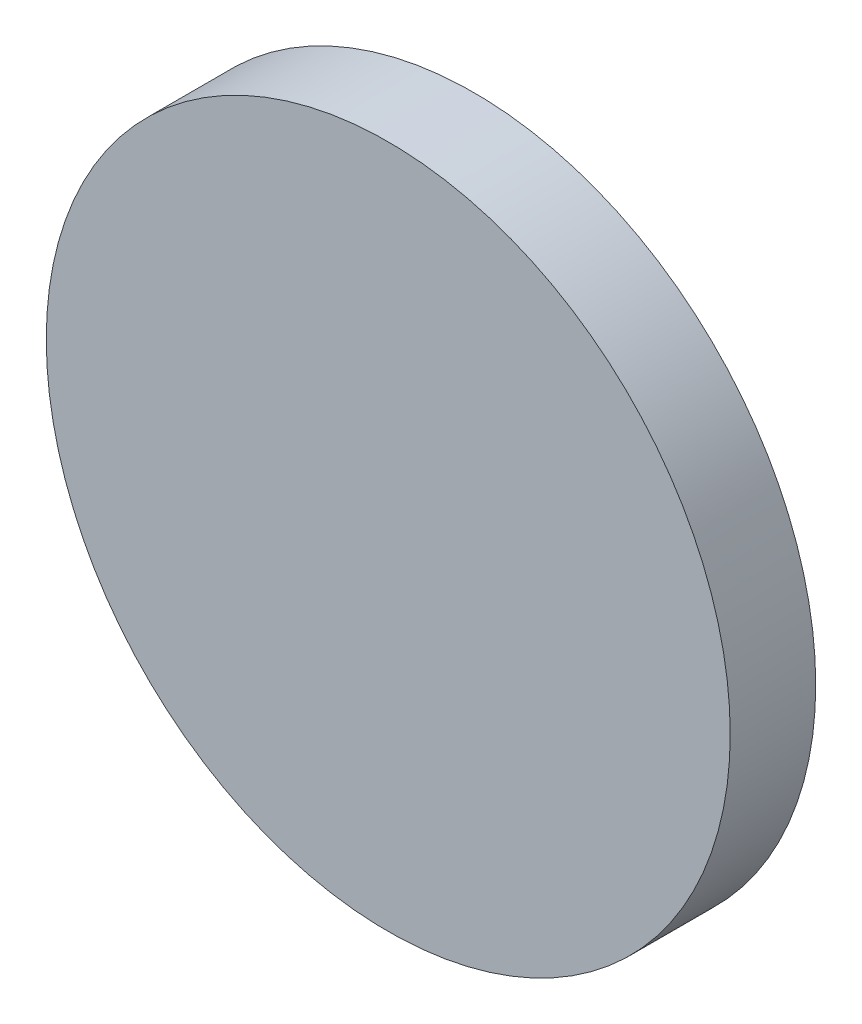
ISO-10303-21;
HEADER;
FILE_DESCRIPTION(('STEP AP214'),'2;1');
FILE_NAME('part.step','',(''),(''),'','','');
FILE_SCHEMA(('AUTOMOTIVE_DESIGN { 1 0 10303 214 1 1 1 1 }'));
ENDSEC;
DATA;
#1=APPLICATION_CONTEXT('core data for automotive mechanical design processes');
#2=APPLICATION_PROTOCOL_DEFINITION('international standard','automotive_design',2000,#1);
#3=PRODUCT_CONTEXT('',#1,'mechanical');
#4=PRODUCT('Part','Part','',(#3));
#5=PRODUCT_RELATED_PRODUCT_CATEGORY('part','',(#4));
#6=PRODUCT_DEFINITION_FORMATION('','',#4);
#7=PRODUCT_DEFINITION_CONTEXT('part definition',#1,'design');
#8=PRODUCT_DEFINITION('design','',#6,#7);
#9=PRODUCT_DEFINITION_SHAPE('','',#8);
#10=(LENGTH_UNIT() NAMED_UNIT(*) SI_UNIT(.MILLI.,.METRE.));
#11=(NAMED_UNIT(*) PLANE_ANGLE_UNIT() SI_UNIT($,.RADIAN.));
#12=(NAMED_UNIT(*) SI_UNIT($,.STERADIAN.) SOLID_ANGLE_UNIT());
#13=UNCERTAINTY_MEASURE_WITH_UNIT(LENGTH_MEASURE(1.E-05),#10,'distance_accuracy_value','');
#14=(GEOMETRIC_REPRESENTATION_CONTEXT(3) GLOBAL_UNCERTAINTY_ASSIGNED_CONTEXT((#13)) GLOBAL_UNIT_ASSIGNED_CONTEXT((#10,
#11,#12)) REPRESENTATION_CONTEXT('',''));
#15=CARTESIAN_POINT('',(0.,0.,0.));
#16=DIRECTION('',(0.,0.,1.));
#17=DIRECTION('',(1.,0.,0.));
#18=AXIS2_PLACEMENT_3D('',#15,#16,#17);
#19=CARTESIAN_POINT('',(0.,0.,10.));
#20=DIRECTION('',(0.,0.,-1.));
#21=DIRECTION('',(-1.,0.,0.));
#22=AXIS2_PLACEMENT_3D('',#19,#20,#21);
#23=CYLINDRICAL_SURFACE('',#22,40.);
#24=CARTESIAN_POINT('',(0.,0.,10.));
#25=DIRECTION('',(0.,0.,1.));
#26=DIRECTION('',(1.,0.,0.));
#27=AXIS2_PLACEMENT_3D('',#24,#25,#26);
#28=CIRCLE('',#27,40.);
#29=CARTESIAN_POINT('',(40.,0.,10.));
#30=VERTEX_POINT('',#29);
#31=EDGE_CURVE('E10',#30,#30,#28,.T.);
#32=ORIENTED_EDGE('',*,*,#31,.F.);
#33=EDGE_LOOP('',(#32));
#34=FACE_BOUND('',#33,.T.);
#35=CARTESIAN_POINT('',(0.,0.,0.));
#36=DIRECTION('',(0.,0.,1.));
#37=DIRECTION('',(1.,0.,0.));
#38=AXIS2_PLACEMENT_3D('',#35,#36,#37);
#39=CIRCLE('',#38,40.);
#40=CARTESIAN_POINT('',(40.,0.,0.));
#41=VERTEX_POINT('',#40);
#42=EDGE_CURVE('E46',#41,#41,#39,.T.);
#43=ORIENTED_EDGE('',*,*,#42,.T.);
#44=EDGE_LOOP('',(#43));
#45=FACE_BOUND('',#44,.T.);
#46=ADVANCED_FACE('F43',(#34,#45),#23,.T.);
#47=CARTESIAN_POINT('',(0.,0.,10.));
#48=DIRECTION('',(0.,0.,1.));
#49=DIRECTION('',(1.,0.,0.));
#50=AXIS2_PLACEMENT_3D('',#47,#48,#49);
#51=PLANE('',#50);
#52=ORIENTED_EDGE('',*,*,#31,.T.);
#53=EDGE_LOOP('',(#52));
#54=FACE_BOUND('',#53,.T.);
#55=ADVANCED_FACE('F60',(#54),#51,.T.);
#56=CARTESIAN_POINT('',(0.,0.,0.));
#57=DIRECTION('',(0.,0.,1.));
#58=DIRECTION('',(1.,0.,0.));
#59=AXIS2_PLACEMENT_3D('',#56,#57,#58);
#60=PLANE('',#59);
#61=ORIENTED_EDGE('',*,*,#42,.F.);
#62=EDGE_LOOP('',(#61));
#63=FACE_BOUND('',#62,.T.);
#64=ADVANCED_FACE('F58',(#63),#60,.F.);
#65=CLOSED_SHELL('',(#46,#55,#64));
#66=MANIFOLD_SOLID_BREP('B2',#65);
#67=ADVANCED_BREP_SHAPE_REPRESENTATION('',(#18,#66),#14);
#68=SHAPE_DEFINITION_REPRESENTATION(#9,#67);
ENDSEC;
END-ISO-10303-21;
